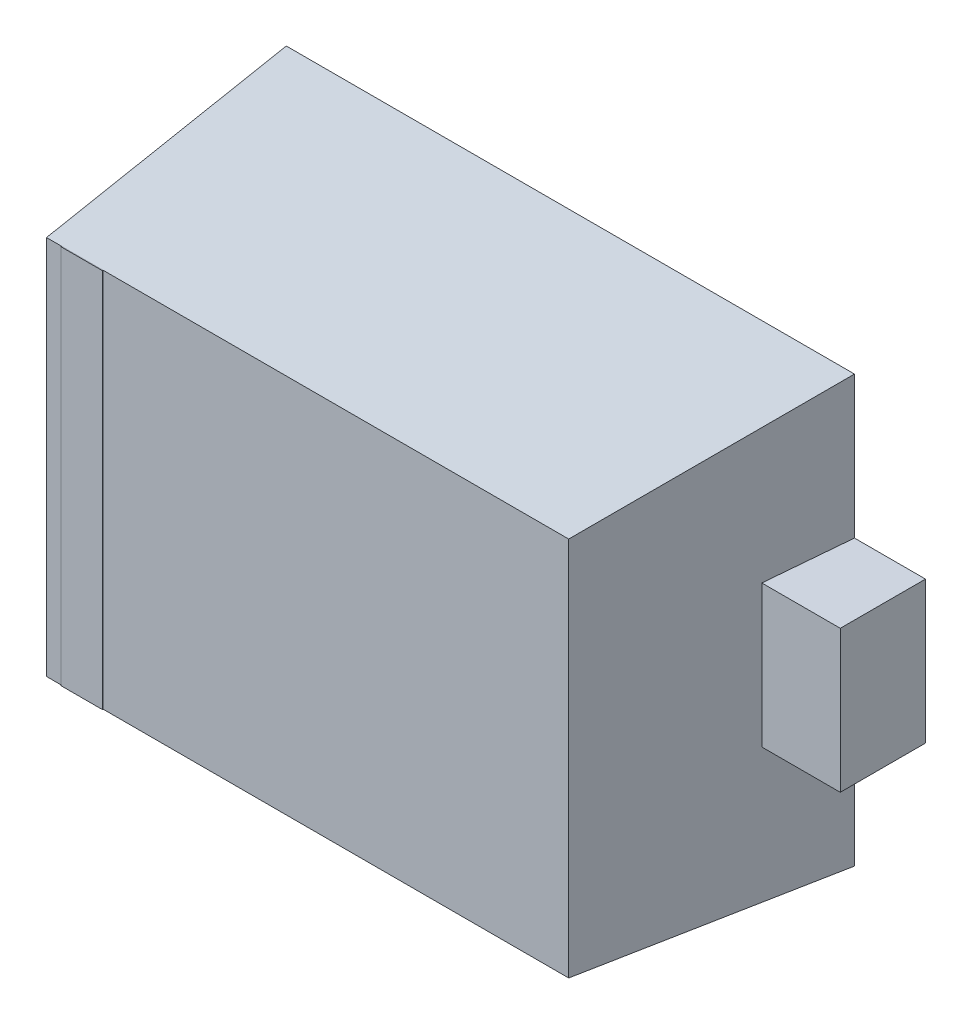
ISO-10303-21;
HEADER;
FILE_DESCRIPTION(('STEP AP214'),'2;1');
FILE_NAME('part.step','',(''),(''),'','','');
FILE_SCHEMA(('AUTOMOTIVE_DESIGN { 1 0 10303 214 1 1 1 1 }'));
ENDSEC;
DATA;
#1=APPLICATION_CONTEXT('core data for automotive mechanical design processes');
#2=APPLICATION_PROTOCOL_DEFINITION('international standard','automotive_design',2000,#1);
#3=PRODUCT_CONTEXT('',#1,'mechanical');
#4=PRODUCT('Part','Part','',(#3));
#5=PRODUCT_RELATED_PRODUCT_CATEGORY('part','',(#4));
#6=PRODUCT_DEFINITION_FORMATION('','',#4);
#7=PRODUCT_DEFINITION_CONTEXT('part definition',#1,'design');
#8=PRODUCT_DEFINITION('design','',#6,#7);
#9=PRODUCT_DEFINITION_SHAPE('','',#8);
#10=(LENGTH_UNIT() NAMED_UNIT(*) SI_UNIT(.MILLI.,.METRE.));
#11=(NAMED_UNIT(*) PLANE_ANGLE_UNIT() SI_UNIT($,.RADIAN.));
#12=(NAMED_UNIT(*) SI_UNIT($,.STERADIAN.) SOLID_ANGLE_UNIT());
#13=UNCERTAINTY_MEASURE_WITH_UNIT(LENGTH_MEASURE(1.E-05),#10,'distance_accuracy_value','');
#14=(GEOMETRIC_REPRESENTATION_CONTEXT(3) GLOBAL_UNCERTAINTY_ASSIGNED_CONTEXT((#13)) GLOBAL_UNIT_ASSIGNED_CONTEXT((#10,
#11,#12)) REPRESENTATION_CONTEXT('',''));
#15=CARTESIAN_POINT('',(0.,0.,0.));
#16=DIRECTION('',(0.,0.,1.));
#17=DIRECTION('',(1.,0.,0.));
#18=AXIS2_PLACEMENT_3D('',#15,#16,#17);
#19=CARTESIAN_POINT('',(0.5,-0.1,0.12));
#20=DIRECTION('',(1.,0.,0.));
#21=DIRECTION('',(0.,0.,-1.));
#22=AXIS2_PLACEMENT_3D('',#19,#20,#21);
#23=PLANE('',#22);
#24=DIRECTION('',(0.,-1.,0.));
#25=VECTOR('',#24,1.);
#26=CARTESIAN_POINT('',(0.5,-0.1,0.));
#27=LINE('',#26,#25);
#28=CARTESIAN_POINT('',(0.5,0.1,0.));
#29=VERTEX_POINT('',#28);
#30=CARTESIAN_POINT('',(0.5,-0.1,0.));
#31=VERTEX_POINT('',#30);
#32=EDGE_CURVE('E127',#29,#31,#27,.T.);
#33=ORIENTED_EDGE('',*,*,#32,.F.);
#34=DIRECTION('',(0.,0.,-1.));
#35=VECTOR('',#34,1.);
#36=CARTESIAN_POINT('',(0.5,0.1,0.12));
#37=LINE('',#36,#35);
#38=CARTESIAN_POINT('',(0.5,0.1,0.12));
#39=VERTEX_POINT('',#38);
#40=EDGE_CURVE('E12',#39,#29,#37,.T.);
#41=ORIENTED_EDGE('',*,*,#40,.F.);
#42=DIRECTION('',(0.,-1.,0.));
#43=VECTOR('',#42,1.);
#44=CARTESIAN_POINT('',(0.5,-0.1,0.12));
#45=LINE('',#44,#43);
#46=CARTESIAN_POINT('',(0.5,-0.1,0.12));
#47=VERTEX_POINT('',#46);
#48=EDGE_CURVE('E118',#39,#47,#45,.T.);
#49=ORIENTED_EDGE('',*,*,#48,.T.);
#50=DIRECTION('',(0.,0.,-1.));
#51=VECTOR('',#50,1.);
#52=CARTESIAN_POINT('',(0.5,-0.1,0.12));
#53=LINE('',#52,#51);
#54=EDGE_CURVE('E59',#47,#31,#53,.T.);
#55=ORIENTED_EDGE('',*,*,#54,.T.);
#56=EDGE_LOOP('',(#33,#41,#49,#55));
#57=FACE_BOUND('',#56,.T.);
#58=ADVANCED_FACE('F56',(#57),#23,.T.);
#59=CARTESIAN_POINT('',(0.5,0.1,0.12));
#60=DIRECTION('',(0.,1.,0.));
#61=DIRECTION('',(-1.,0.,0.));
#62=AXIS2_PLACEMENT_3D('',#59,#60,#61);
#63=PLANE('',#62);
#64=DIRECTION('',(1.,0.,0.));
#65=VECTOR('',#64,1.);
#66=CARTESIAN_POINT('',(0.5,0.1,0.));
#67=LINE('',#66,#65);
#68=CARTESIAN_POINT('',(0.31,0.1,0.));
#69=VERTEX_POINT('',#68);
#70=EDGE_CURVE('E122',#69,#29,#67,.T.);
#71=ORIENTED_EDGE('',*,*,#70,.F.);
#72=DIRECTION('',(0.,0.,-1.));
#73=VECTOR('',#72,1.);
#74=CARTESIAN_POINT('',(0.31,0.1,0.12));
#75=LINE('',#74,#73);
#76=CARTESIAN_POINT('',(0.31,0.1,0.12));
#77=VERTEX_POINT('',#76);
#78=EDGE_CURVE('E66',#77,#69,#75,.T.);
#79=ORIENTED_EDGE('',*,*,#78,.F.);
#80=DIRECTION('',(1.,0.,0.));
#81=VECTOR('',#80,1.);
#82=CARTESIAN_POINT('',(0.5,0.1,0.12));
#83=LINE('',#82,#81);
#84=EDGE_CURVE('E113',#77,#39,#83,.T.);
#85=ORIENTED_EDGE('',*,*,#84,.T.);
#86=ORIENTED_EDGE('',*,*,#40,.T.);
#87=EDGE_LOOP('',(#71,#79,#85,#86));
#88=FACE_BOUND('',#87,.T.);
#89=ADVANCED_FACE('F142',(#88),#63,.T.);
#90=CARTESIAN_POINT('',(0.31,-0.1,0.12));
#91=DIRECTION('',(-1.,0.,0.));
#92=DIRECTION('',(0.,0.,1.));
#93=AXIS2_PLACEMENT_3D('',#90,#91,#92);
#94=PLANE('',#93);
#95=DIRECTION('',(0.,1.,0.));
#96=VECTOR('',#95,1.);
#97=CARTESIAN_POINT('',(0.31,-0.1,0.));
#98=LINE('',#97,#96);
#99=CARTESIAN_POINT('',(0.31,-0.1,0.));
#100=VERTEX_POINT('',#99);
#101=EDGE_CURVE('E107',#100,#69,#98,.T.);
#102=ORIENTED_EDGE('',*,*,#101,.F.);
#103=DIRECTION('',(0.,0.,-1.));
#104=VECTOR('',#103,1.);
#105=CARTESIAN_POINT('',(0.31,-0.1,0.12));
#106=LINE('',#105,#104);
#107=CARTESIAN_POINT('',(0.31,-0.1,0.12));
#108=VERTEX_POINT('',#107);
#109=EDGE_CURVE('E102',#108,#100,#106,.T.);
#110=ORIENTED_EDGE('',*,*,#109,.F.);
#111=DIRECTION('',(0.,1.,0.));
#112=VECTOR('',#111,1.);
#113=CARTESIAN_POINT('',(0.31,-0.1,0.12));
#114=LINE('',#113,#112);
#115=EDGE_CURVE('E105',#108,#77,#114,.T.);
#116=ORIENTED_EDGE('',*,*,#115,.T.);
#117=ORIENTED_EDGE('',*,*,#78,.T.);
#118=EDGE_LOOP('',(#102,#110,#116,#117));
#119=FACE_BOUND('',#118,.T.);
#120=ADVANCED_FACE('F104',(#119),#94,.T.);
#121=CARTESIAN_POINT('',(0.5,-0.1,0.12));
#122=DIRECTION('',(0.,-1.,0.));
#123=DIRECTION('',(1.,0.,0.));
#124=AXIS2_PLACEMENT_3D('',#121,#122,#123);
#125=PLANE('',#124);
#126=DIRECTION('',(-1.,0.,0.));
#127=VECTOR('',#126,1.);
#128=CARTESIAN_POINT('',(0.5,-0.1,0.));
#129=LINE('',#128,#127);
#130=EDGE_CURVE('E131',#31,#100,#129,.T.);
#131=ORIENTED_EDGE('',*,*,#130,.F.);
#132=ORIENTED_EDGE('',*,*,#54,.F.);
#133=DIRECTION('',(-1.,0.,0.));
#134=VECTOR('',#133,1.);
#135=CARTESIAN_POINT('',(0.5,-0.1,0.12));
#136=LINE('',#135,#134);
#137=EDGE_CURVE('E112',#47,#108,#136,.T.);
#138=ORIENTED_EDGE('',*,*,#137,.T.);
#139=ORIENTED_EDGE('',*,*,#109,.T.);
#140=EDGE_LOOP('',(#131,#132,#138,#139));
#141=FACE_BOUND('',#140,.T.);
#142=ADVANCED_FACE('F116',(#141),#125,.T.);
#143=CARTESIAN_POINT('',(0.,0.,0.12));
#144=DIRECTION('',(0.,0.,1.));
#145=DIRECTION('',(1.,0.,0.));
#146=AXIS2_PLACEMENT_3D('',#143,#144,#145);
#147=PLANE('',#146);
#148=ORIENTED_EDGE('',*,*,#48,.F.);
#149=ORIENTED_EDGE('',*,*,#84,.F.);
#150=ORIENTED_EDGE('',*,*,#115,.F.);
#151=ORIENTED_EDGE('',*,*,#137,.F.);
#152=EDGE_LOOP('',(#148,#149,#150,#151));
#153=FACE_BOUND('',#152,.T.);
#154=ADVANCED_FACE('F111',(#153),#147,.T.);
#155=CARTESIAN_POINT('',(0.,0.,0.));
#156=DIRECTION('',(0.,0.,1.));
#157=DIRECTION('',(1.,0.,0.));
#158=AXIS2_PLACEMENT_3D('',#155,#156,#157);
#159=PLANE('',#158);
#160=ORIENTED_EDGE('',*,*,#32,.T.);
#161=ORIENTED_EDGE('',*,*,#130,.T.);
#162=ORIENTED_EDGE('',*,*,#101,.T.);
#163=ORIENTED_EDGE('',*,*,#70,.T.);
#164=EDGE_LOOP('',(#160,#161,#162,#163));
#165=FACE_BOUND('',#164,.T.);
#166=ADVANCED_FACE('F141',(#165),#159,.F.);
#167=CLOSED_SHELL('',(#58,#89,#120,#142,#154,#166));
#168=MANIFOLD_SOLID_BREP('B2',#167);
#169=CARTESIAN_POINT('',(-0.31,-0.1,0.12));
#170=DIRECTION('',(1.,0.,0.));
#171=DIRECTION('',(0.,0.,-1.));
#172=AXIS2_PLACEMENT_3D('',#169,#170,#171);
#173=PLANE('',#172);
#174=DIRECTION('',(0.,-1.,0.));
#175=VECTOR('',#174,1.);
#176=CARTESIAN_POINT('',(-0.31,-0.1,0.));
#177=LINE('',#176,#175);
#178=CARTESIAN_POINT('',(-0.31,0.1,0.));
#179=VERTEX_POINT('',#178);
#180=CARTESIAN_POINT('',(-0.31,-0.1,0.));
#181=VERTEX_POINT('',#180);
#182=EDGE_CURVE('E277',#179,#181,#177,.T.);
#183=ORIENTED_EDGE('',*,*,#182,.F.);
#184=DIRECTION('',(0.,0.,-1.));
#185=VECTOR('',#184,1.);
#186=CARTESIAN_POINT('',(-0.31,0.1,0.12));
#187=LINE('',#186,#185);
#188=CARTESIAN_POINT('',(-0.31,0.1,0.12));
#189=VERTEX_POINT('',#188);
#190=EDGE_CURVE('E54',#189,#179,#187,.T.);
#191=ORIENTED_EDGE('',*,*,#190,.F.);
#192=DIRECTION('',(0.,-1.,0.));
#193=VECTOR('',#192,1.);
#194=CARTESIAN_POINT('',(-0.31,-0.1,0.12));
#195=LINE('',#194,#193);
#196=CARTESIAN_POINT('',(-0.31,-0.1,0.12));
#197=VERTEX_POINT('',#196);
#198=EDGE_CURVE('E269',#189,#197,#195,.T.);
#199=ORIENTED_EDGE('',*,*,#198,.T.);
#200=DIRECTION('',(0.,0.,-1.));
#201=VECTOR('',#200,1.);
#202=CARTESIAN_POINT('',(-0.31,-0.1,0.12));
#203=LINE('',#202,#201);
#204=EDGE_CURVE('E210',#197,#181,#203,.T.);
#205=ORIENTED_EDGE('',*,*,#204,.T.);
#206=EDGE_LOOP('',(#183,#191,#199,#205));
#207=FACE_BOUND('',#206,.T.);
#208=ADVANCED_FACE('F207',(#207),#173,.T.);
#209=CARTESIAN_POINT('',(-0.5,0.1,0.12));
#210=DIRECTION('',(0.,1.,0.));
#211=DIRECTION('',(-1.,0.,0.));
#212=AXIS2_PLACEMENT_3D('',#209,#210,#211);
#213=PLANE('',#212);
#214=DIRECTION('',(1.,0.,0.));
#215=VECTOR('',#214,1.);
#216=CARTESIAN_POINT('',(-0.5,0.1,0.));
#217=LINE('',#216,#215);
#218=CARTESIAN_POINT('',(-0.5,0.1,0.));
#219=VERTEX_POINT('',#218);
#220=EDGE_CURVE('E272',#219,#179,#217,.T.);
#221=ORIENTED_EDGE('',*,*,#220,.F.);
#222=DIRECTION('',(0.,0.,-1.));
#223=VECTOR('',#222,1.);
#224=CARTESIAN_POINT('',(-0.5,0.1,0.12));
#225=LINE('',#224,#223);
#226=CARTESIAN_POINT('',(-0.5,0.1,0.12));
#227=VERTEX_POINT('',#226);
#228=EDGE_CURVE('E217',#227,#219,#225,.T.);
#229=ORIENTED_EDGE('',*,*,#228,.F.);
#230=DIRECTION('',(1.,0.,0.));
#231=VECTOR('',#230,1.);
#232=CARTESIAN_POINT('',(-0.5,0.1,0.12));
#233=LINE('',#232,#231);
#234=EDGE_CURVE('E264',#227,#189,#233,.T.);
#235=ORIENTED_EDGE('',*,*,#234,.T.);
#236=ORIENTED_EDGE('',*,*,#190,.T.);
#237=EDGE_LOOP('',(#221,#229,#235,#236));
#238=FACE_BOUND('',#237,.T.);
#239=ADVANCED_FACE('F293',(#238),#213,.T.);
#240=CARTESIAN_POINT('',(-0.5,-0.1,0.12));
#241=DIRECTION('',(-1.,0.,0.));
#242=DIRECTION('',(0.,0.,1.));
#243=AXIS2_PLACEMENT_3D('',#240,#241,#242);
#244=PLANE('',#243);
#245=DIRECTION('',(0.,1.,0.));
#246=VECTOR('',#245,1.);
#247=CARTESIAN_POINT('',(-0.5,-0.1,0.));
#248=LINE('',#247,#246);
#249=CARTESIAN_POINT('',(-0.5,-0.1,0.));
#250=VERTEX_POINT('',#249);
#251=EDGE_CURVE('E258',#250,#219,#248,.T.);
#252=ORIENTED_EDGE('',*,*,#251,.F.);
#253=DIRECTION('',(0.,0.,-1.));
#254=VECTOR('',#253,1.);
#255=CARTESIAN_POINT('',(-0.5,-0.1,0.12));
#256=LINE('',#255,#254);
#257=CARTESIAN_POINT('',(-0.5,-0.1,0.12));
#258=VERTEX_POINT('',#257);
#259=EDGE_CURVE('E253',#258,#250,#256,.T.);
#260=ORIENTED_EDGE('',*,*,#259,.F.);
#261=DIRECTION('',(0.,1.,0.));
#262=VECTOR('',#261,1.);
#263=CARTESIAN_POINT('',(-0.5,-0.1,0.12));
#264=LINE('',#263,#262);
#265=EDGE_CURVE('E256',#258,#227,#264,.T.);
#266=ORIENTED_EDGE('',*,*,#265,.T.);
#267=ORIENTED_EDGE('',*,*,#228,.T.);
#268=EDGE_LOOP('',(#252,#260,#266,#267));
#269=FACE_BOUND('',#268,.T.);
#270=ADVANCED_FACE('F255',(#269),#244,.T.);
#271=CARTESIAN_POINT('',(-0.5,-0.1,0.12));
#272=DIRECTION('',(0.,-1.,0.));
#273=DIRECTION('',(1.,0.,0.));
#274=AXIS2_PLACEMENT_3D('',#271,#272,#273);
#275=PLANE('',#274);
#276=DIRECTION('',(-1.,0.,0.));
#277=VECTOR('',#276,1.);
#278=CARTESIAN_POINT('',(-0.5,-0.1,0.));
#279=LINE('',#278,#277);
#280=EDGE_CURVE('E281',#181,#250,#279,.T.);
#281=ORIENTED_EDGE('',*,*,#280,.F.);
#282=ORIENTED_EDGE('',*,*,#204,.F.);
#283=DIRECTION('',(-1.,0.,0.));
#284=VECTOR('',#283,1.);
#285=CARTESIAN_POINT('',(-0.5,-0.1,0.12));
#286=LINE('',#285,#284);
#287=EDGE_CURVE('E263',#197,#258,#286,.T.);
#288=ORIENTED_EDGE('',*,*,#287,.T.);
#289=ORIENTED_EDGE('',*,*,#259,.T.);
#290=EDGE_LOOP('',(#281,#282,#288,#289));
#291=FACE_BOUND('',#290,.T.);
#292=ADVANCED_FACE('F267',(#291),#275,.T.);
#293=CARTESIAN_POINT('',(0.,0.,0.12));
#294=DIRECTION('',(0.,0.,-1.));
#295=DIRECTION('',(-1.,0.,0.));
#296=AXIS2_PLACEMENT_3D('',#293,#294,#295);
#297=PLANE('',#296);
#298=ORIENTED_EDGE('',*,*,#198,.F.);
#299=ORIENTED_EDGE('',*,*,#234,.F.);
#300=ORIENTED_EDGE('',*,*,#265,.F.);
#301=ORIENTED_EDGE('',*,*,#287,.F.);
#302=EDGE_LOOP('',(#298,#299,#300,#301));
#303=FACE_BOUND('',#302,.T.);
#304=ADVANCED_FACE('F262',(#303),#297,.F.);
#305=CARTESIAN_POINT('',(0.,0.,0.));
#306=DIRECTION('',(0.,0.,-1.));
#307=DIRECTION('',(-1.,0.,0.));
#308=AXIS2_PLACEMENT_3D('',#305,#306,#307);
#309=PLANE('',#308);
#310=ORIENTED_EDGE('',*,*,#182,.T.);
#311=ORIENTED_EDGE('',*,*,#280,.T.);
#312=ORIENTED_EDGE('',*,*,#251,.T.);
#313=ORIENTED_EDGE('',*,*,#220,.T.);
#314=EDGE_LOOP('',(#310,#311,#312,#313));
#315=FACE_BOUND('',#314,.T.);
#316=ADVANCED_FACE('F292',(#315),#309,.T.);
#317=CLOSED_SHELL('',(#208,#239,#270,#292,#304,#316));
#318=MANIFOLD_SOLID_BREP('B6',#317);
#319=CARTESIAN_POINT('',(0.,0.,0.37));
#320=DIRECTION('',(0.,0.,-1.));
#321=DIRECTION('',(-1.,0.,0.));
#322=AXIS2_PLACEMENT_3D('',#319,#320,#321);
#323=PLANE('',#322);
#324=DIRECTION('',(0.,-1.,0.));
#325=VECTOR('',#324,1.);
#326=CARTESIAN_POINT('',(-0.346104471095288,0.267629194495408,0.37));
#327=LINE('',#326,#325);
#328=CARTESIAN_POINT('',(-0.346104471095288,0.267629194495408,0.37));
#329=VERTEX_POINT('',#328);
#330=CARTESIAN_POINT('',(-0.346104471095288,-0.267629194495408,0.37));
#331=VERTEX_POINT('',#330);
#332=EDGE_CURVE('E443',#329,#331,#327,.T.);
#333=ORIENTED_EDGE('',*,*,#332,.F.);
#334=DIRECTION('',(1.,0.,0.));
#335=VECTOR('',#334,1.);
#336=CARTESIAN_POINT('',(0.,0.267629194495408,0.37));
#337=LINE('',#336,#335);
#338=CARTESIAN_POINT('',(-0.367629194495408,0.267629194495408,0.37));
#339=VERTEX_POINT('',#338);
#340=EDGE_CURVE('E482',#329,#339,#337,.F.);
#341=ORIENTED_EDGE('',*,*,#340,.T.);
#342=DIRECTION('',(0.,1.,0.));
#343=VECTOR('',#342,1.);
#344=CARTESIAN_POINT('',(-0.367629194495408,0.,0.37));
#345=LINE('',#344,#343);
#346=CARTESIAN_POINT('',(-0.367629194495408,-0.267629194495408,0.37));
#347=VERTEX_POINT('',#346);
#348=EDGE_CURVE('E485',#339,#347,#345,.F.);
#349=ORIENTED_EDGE('',*,*,#348,.T.);
#350=DIRECTION('',(-1.,0.,0.));
#351=VECTOR('',#350,1.);
#352=CARTESIAN_POINT('',(0.,-0.267629194495408,0.37));
#353=LINE('',#352,#351);
#354=EDGE_CURVE('E353',#347,#331,#353,.F.);
#355=ORIENTED_EDGE('',*,*,#354,.T.);
#356=EDGE_LOOP('',(#333,#341,#349,#355));
#357=FACE_BOUND('',#356,.T.);
#358=ADVANCED_FACE('F349',(#357),#323,.F.);
#359=DIRECTION('',(0.,1.,0.));
#360=VECTOR('',#359,1.);
#361=CARTESIAN_POINT('',(-0.287787878363588,0.267629194495408,0.37));
#362=LINE('',#361,#360);
#363=CARTESIAN_POINT('',(-0.287787878363588,-0.267629194495408,0.37));
#364=VERTEX_POINT('',#363);
#365=CARTESIAN_POINT('',(-0.287787878363588,0.267629194495408,0.37));
#366=VERTEX_POINT('',#365);
#367=EDGE_CURVE('E367',#364,#366,#362,.T.);
#368=ORIENTED_EDGE('',*,*,#367,.F.);
#369=CARTESIAN_POINT('',(0.367629194495408,-0.267629194495408,0.37));
#370=VERTEX_POINT('',#369);
#371=EDGE_CURVE('E487',#364,#370,#353,.F.);
#372=ORIENTED_EDGE('',*,*,#371,.T.);
#373=DIRECTION('',(0.,-1.,0.));
#374=VECTOR('',#373,1.);
#375=CARTESIAN_POINT('',(0.367629194495408,0.,0.37));
#376=LINE('',#375,#374);
#377=CARTESIAN_POINT('',(0.367629194495408,0.267629194495408,0.37));
#378=VERTEX_POINT('',#377);
#379=EDGE_CURVE('E466',#370,#378,#376,.F.);
#380=ORIENTED_EDGE('',*,*,#379,.T.);
#381=EDGE_CURVE('E483',#378,#366,#337,.F.);
#382=ORIENTED_EDGE('',*,*,#381,.T.);
#383=EDGE_LOOP('',(#368,#372,#380,#382));
#384=FACE_BOUND('',#383,.T.);
#385=ADVANCED_FACE('F564',(#384),#323,.F.);
#386=CARTESIAN_POINT('',(0.4,-0.3,0.));
#387=DIRECTION('',(0.996194698091746,0.,0.0871557427476584));
#388=DIRECTION('',(0.0871557427476584,0.,-0.996194698091746));
#389=AXIS2_PLACEMENT_3D('',#386,#387,#388);
#390=PLANE('',#389);
#391=DIRECTION('',(0.,1.,0.));
#392=VECTOR('',#391,1.);
#393=CARTESIAN_POINT('',(0.4,-0.3,0.));
#394=LINE('',#393,#392);
#395=CARTESIAN_POINT('',(0.4,-0.3,0.));
#396=VERTEX_POINT('',#395);
#397=CARTESIAN_POINT('',(0.4,0.3,0.));
#398=VERTEX_POINT('',#397);
#399=EDGE_CURVE('E445',#396,#398,#394,.T.);
#400=ORIENTED_EDGE('',*,*,#399,.T.);
#401=DIRECTION('',(0.0868265938642478,0.0868265938642478,-0.992432509138967));
#402=VECTOR('',#401,1.);
#403=CARTESIAN_POINT('',(0.393968914078346,0.293968914078346,0.0689356275269484));
#404=LINE('',#403,#402);
#405=EDGE_CURVE('E205',#378,#398,#404,.T.);
#406=ORIENTED_EDGE('',*,*,#405,.F.);
#407=ORIENTED_EDGE('',*,*,#379,.F.);
#408=DIRECTION('',(0.0868265938642478,-0.0868265938642478,-0.992432509138967));
#409=VECTOR('',#408,1.);
#410=CARTESIAN_POINT('',(0.4,-0.3,0.));
#411=LINE('',#410,#409);
#412=EDGE_CURVE('E468',#370,#396,#411,.T.);
#413=ORIENTED_EDGE('',*,*,#412,.T.);
#414=EDGE_LOOP('',(#400,#406,#407,#413));
#415=FACE_BOUND('',#414,.T.);
#416=ADVANCED_FACE('F507',(#415),#390,.T.);
#417=CARTESIAN_POINT('',(-0.4,0.3,0.));
#418=DIRECTION('',(0.,0.996194698091746,0.0871557427476584));
#419=DIRECTION('',(0.,-0.0871557427476584,0.996194698091746));
#420=AXIS2_PLACEMENT_3D('',#417,#418,#419);
#421=PLANE('',#420);
#422=DIRECTION('',(-1.,0.,0.));
#423=VECTOR('',#422,1.);
#424=CARTESIAN_POINT('',(-0.4,0.3,0.));
#425=LINE('',#424,#423);
#426=CARTESIAN_POINT('',(-0.4,0.3,0.));
#427=VERTEX_POINT('',#426);
#428=EDGE_CURVE('E452',#398,#427,#425,.T.);
#429=ORIENTED_EDGE('',*,*,#428,.T.);
#430=DIRECTION('',(-0.0868265938642478,0.0868265938642478,-0.992432509138967));
#431=VECTOR('',#430,1.);
#432=CARTESIAN_POINT('',(-0.39547668555876,0.29547668555876,0.0517017206452113));
#433=LINE('',#432,#431);
#434=EDGE_CURVE('E359',#339,#427,#433,.T.);
#435=ORIENTED_EDGE('',*,*,#434,.F.);
#436=ORIENTED_EDGE('',*,*,#340,.F.);
#437=DIRECTION('',(-1.,0.,0.));
#438=VECTOR('',#437,1.);
#439=CARTESIAN_POINT('',(-0.346104471095288,0.267629194495408,0.37));
#440=LINE('',#439,#438);
#441=EDGE_CURVE('E440',#366,#329,#440,.T.);
#442=ORIENTED_EDGE('',*,*,#441,.F.);
#443=ORIENTED_EDGE('',*,*,#381,.F.);
#444=ORIENTED_EDGE('',*,*,#405,.T.);
#445=EDGE_LOOP('',(#429,#435,#436,#442,#443,#444));
#446=FACE_BOUND('',#445,.T.);
#447=ADVANCED_FACE('F351',(#446),#421,.T.);
#448=CARTESIAN_POINT('',(-0.4,-0.3,0.));
#449=DIRECTION('',(-0.996194698091746,0.,0.0871557427476584));
#450=DIRECTION('',(0.0871557427476584,0.,0.996194698091746));
#451=AXIS2_PLACEMENT_3D('',#448,#449,#450);
#452=PLANE('',#451);
#453=DIRECTION('',(0.,-1.,0.));
#454=VECTOR('',#453,1.);
#455=CARTESIAN_POINT('',(-0.4,-0.3,0.));
#456=LINE('',#455,#454);
#457=CARTESIAN_POINT('',(-0.4,-0.3,0.));
#458=VERTEX_POINT('',#457);
#459=EDGE_CURVE('E461',#427,#458,#456,.T.);
#460=ORIENTED_EDGE('',*,*,#459,.T.);
#461=DIRECTION('',(-0.0868265938642478,-0.0868265938642478,-0.992432509138967));
#462=VECTOR('',#461,1.);
#463=CARTESIAN_POINT('',(-0.4,-0.3,0.));
#464=LINE('',#463,#462);
#465=EDGE_CURVE('E472',#347,#458,#464,.T.);
#466=ORIENTED_EDGE('',*,*,#465,.F.);
#467=ORIENTED_EDGE('',*,*,#348,.F.);
#468=ORIENTED_EDGE('',*,*,#434,.T.);
#469=EDGE_LOOP('',(#460,#466,#467,#468));
#470=FACE_BOUND('',#469,.T.);
#471=ADVANCED_FACE('F556',(#470),#452,.T.);
#472=CARTESIAN_POINT('',(-0.4,-0.3,0.));
#473=DIRECTION('',(0.,-0.996194698091746,0.0871557427476584));
#474=DIRECTION('',(0.,-0.0871557427476584,-0.996194698091746));
#475=AXIS2_PLACEMENT_3D('',#472,#473,#474);
#476=PLANE('',#475);
#477=DIRECTION('',(1.,0.,0.));
#478=VECTOR('',#477,1.);
#479=CARTESIAN_POINT('',(-0.4,-0.3,0.));
#480=LINE('',#479,#478);
#481=EDGE_CURVE('E464',#458,#396,#480,.T.);
#482=ORIENTED_EDGE('',*,*,#481,.T.);
#483=ORIENTED_EDGE('',*,*,#412,.F.);
#484=ORIENTED_EDGE('',*,*,#371,.F.);
#485=DIRECTION('',(1.,0.,0.));
#486=VECTOR('',#485,1.);
#487=CARTESIAN_POINT('',(-0.346104471095288,-0.267629194495408,0.37));
#488=LINE('',#487,#486);
#489=EDGE_CURVE('E374',#331,#364,#488,.T.);
#490=ORIENTED_EDGE('',*,*,#489,.F.);
#491=ORIENTED_EDGE('',*,*,#354,.F.);
#492=ORIENTED_EDGE('',*,*,#465,.T.);
#493=EDGE_LOOP('',(#482,#483,#484,#490,#491,#492));
#494=FACE_BOUND('',#493,.T.);
#495=ADVANCED_FACE('F498',(#494),#476,.T.);
#496=CARTESIAN_POINT('',(0.,0.,0.));
#497=DIRECTION('',(0.,0.,-1.));
#498=DIRECTION('',(-1.,0.,0.));
#499=AXIS2_PLACEMENT_3D('',#496,#497,#498);
#500=PLANE('',#499);
#501=ORIENTED_EDGE('',*,*,#399,.F.);
#502=ORIENTED_EDGE('',*,*,#481,.F.);
#503=ORIENTED_EDGE('',*,*,#459,.F.);
#504=ORIENTED_EDGE('',*,*,#428,.F.);
#505=EDGE_LOOP('',(#501,#502,#503,#504));
#506=FACE_BOUND('',#505,.T.);
#507=ADVANCED_FACE('F504',(#506),#500,.T.);
#508=CARTESIAN_POINT('',(-0.346104471095288,0.267629194495408,0.371));
#509=DIRECTION('',(1.,0.,0.));
#510=DIRECTION('',(0.,0.,-1.));
#511=AXIS2_PLACEMENT_3D('',#508,#509,#510);
#512=PLANE('',#511);
#513=ORIENTED_EDGE('',*,*,#332,.T.);
#514=DIRECTION('',(0.,0.,-1.));
#515=VECTOR('',#514,1.);
#516=CARTESIAN_POINT('',(-0.346104471095288,-0.267629194495408,0.371));
#517=LINE('',#516,#515);
#518=CARTESIAN_POINT('',(-0.346104471095288,-0.267629194495408,0.371));
#519=VERTEX_POINT('',#518);
#520=EDGE_CURVE('E422',#519,#331,#517,.T.);
#521=ORIENTED_EDGE('',*,*,#520,.F.);
#522=DIRECTION('',(0.,-1.,0.));
#523=VECTOR('',#522,1.);
#524=CARTESIAN_POINT('',(-0.346104471095288,0.267629194495408,0.371));
#525=LINE('',#524,#523);
#526=CARTESIAN_POINT('',(-0.346104471095288,0.267629194495408,0.371));
#527=VERTEX_POINT('',#526);
#528=EDGE_CURVE('E430',#527,#519,#525,.T.);
#529=ORIENTED_EDGE('',*,*,#528,.F.);
#530=DIRECTION('',(0.,0.,-1.));
#531=VECTOR('',#530,1.);
#532=CARTESIAN_POINT('',(-0.346104471095288,0.267629194495408,0.371));
#533=LINE('',#532,#531);
#534=EDGE_CURVE('E520',#527,#329,#533,.T.);
#535=ORIENTED_EDGE('',*,*,#534,.T.);
#536=EDGE_LOOP('',(#513,#521,#529,#535));
#537=FACE_BOUND('',#536,.T.);
#538=ADVANCED_FACE('F442',(#537),#512,.F.);
#539=CARTESIAN_POINT('',(-0.346104471095288,-0.267629194495408,0.371));
#540=DIRECTION('',(0.,1.,0.));
#541=DIRECTION('',(0.,0.,1.));
#542=AXIS2_PLACEMENT_3D('',#539,#540,#541);
#543=PLANE('',#542);
#544=ORIENTED_EDGE('',*,*,#489,.T.);
#545=DIRECTION('',(0.,0.,-1.));
#546=VECTOR('',#545,1.);
#547=CARTESIAN_POINT('',(-0.287787878363588,-0.267629194495408,0.371));
#548=LINE('',#547,#546);
#549=CARTESIAN_POINT('',(-0.287787878363588,-0.267629194495408,0.371));
#550=VERTEX_POINT('',#549);
#551=EDGE_CURVE('E425',#550,#364,#548,.T.);
#552=ORIENTED_EDGE('',*,*,#551,.F.);
#553=DIRECTION('',(1.,0.,0.));
#554=VECTOR('',#553,1.);
#555=CARTESIAN_POINT('',(-0.346104471095288,-0.267629194495408,0.371));
#556=LINE('',#555,#554);
#557=EDGE_CURVE('E418',#519,#550,#556,.T.);
#558=ORIENTED_EDGE('',*,*,#557,.F.);
#559=ORIENTED_EDGE('',*,*,#520,.T.);
#560=EDGE_LOOP('',(#544,#552,#558,#559));
#561=FACE_BOUND('',#560,.T.);
#562=ADVANCED_FACE('F420',(#561),#543,.F.);
#563=CARTESIAN_POINT('',(-0.287787878363588,0.267629194495408,0.371));
#564=DIRECTION('',(-1.,0.,0.));
#565=DIRECTION('',(0.,0.,1.));
#566=AXIS2_PLACEMENT_3D('',#563,#564,#565);
#567=PLANE('',#566);
#568=ORIENTED_EDGE('',*,*,#367,.T.);
#569=DIRECTION('',(0.,0.,-1.));
#570=VECTOR('',#569,1.);
#571=CARTESIAN_POINT('',(-0.287787878363588,0.267629194495408,0.371));
#572=LINE('',#571,#570);
#573=CARTESIAN_POINT('',(-0.287787878363588,0.267629194495408,0.371));
#574=VERTEX_POINT('',#573);
#575=EDGE_CURVE('E455',#574,#366,#572,.T.);
#576=ORIENTED_EDGE('',*,*,#575,.F.);
#577=DIRECTION('',(0.,1.,0.));
#578=VECTOR('',#577,1.);
#579=CARTESIAN_POINT('',(-0.287787878363588,0.267629194495408,0.371));
#580=LINE('',#579,#578);
#581=EDGE_CURVE('E429',#550,#574,#580,.T.);
#582=ORIENTED_EDGE('',*,*,#581,.F.);
#583=ORIENTED_EDGE('',*,*,#551,.T.);
#584=EDGE_LOOP('',(#568,#576,#582,#583));
#585=FACE_BOUND('',#584,.T.);
#586=ADVANCED_FACE('F512',(#585),#567,.F.);
#587=CARTESIAN_POINT('',(-0.346104471095288,0.267629194495408,0.371));
#588=DIRECTION('',(0.,-1.,0.));
#589=DIRECTION('',(0.,0.,-1.));
#590=AXIS2_PLACEMENT_3D('',#587,#588,#589);
#591=PLANE('',#590);
#592=ORIENTED_EDGE('',*,*,#441,.T.);
#593=ORIENTED_EDGE('',*,*,#534,.F.);
#594=DIRECTION('',(-1.,0.,0.));
#595=VECTOR('',#594,1.);
#596=CARTESIAN_POINT('',(-0.346104471095288,0.267629194495408,0.371));
#597=LINE('',#596,#595);
#598=EDGE_CURVE('E435',#574,#527,#597,.T.);
#599=ORIENTED_EDGE('',*,*,#598,.F.);
#600=ORIENTED_EDGE('',*,*,#575,.T.);
#601=EDGE_LOOP('',(#592,#593,#599,#600));
#602=FACE_BOUND('',#601,.T.);
#603=ADVANCED_FACE('F531',(#602),#591,.F.);
#604=CARTESIAN_POINT('',(0.,0.,0.371));
#605=DIRECTION('',(0.,0.,1.));
#606=DIRECTION('',(1.,0.,0.));
#607=AXIS2_PLACEMENT_3D('',#604,#605,#606);
#608=PLANE('',#607);
#609=ORIENTED_EDGE('',*,*,#528,.T.);
#610=ORIENTED_EDGE('',*,*,#557,.T.);
#611=ORIENTED_EDGE('',*,*,#581,.T.);
#612=ORIENTED_EDGE('',*,*,#598,.T.);
#613=EDGE_LOOP('',(#609,#610,#611,#612));
#614=FACE_BOUND('',#613,.T.);
#615=ADVANCED_FACE('F433',(#614),#608,.T.);
#616=CLOSED_SHELL('',(#358,#385,#416,#447,#471,#495,#507,#538,#562,#586,#603,#615));
#617=MANIFOLD_SOLID_BREP('B48',#616);
#618=ADVANCED_BREP_SHAPE_REPRESENTATION('',(#18,#168,#318,#617),#14);
#619=SHAPE_DEFINITION_REPRESENTATION(#9,#618);
ENDSEC;
END-ISO-10303-21;
